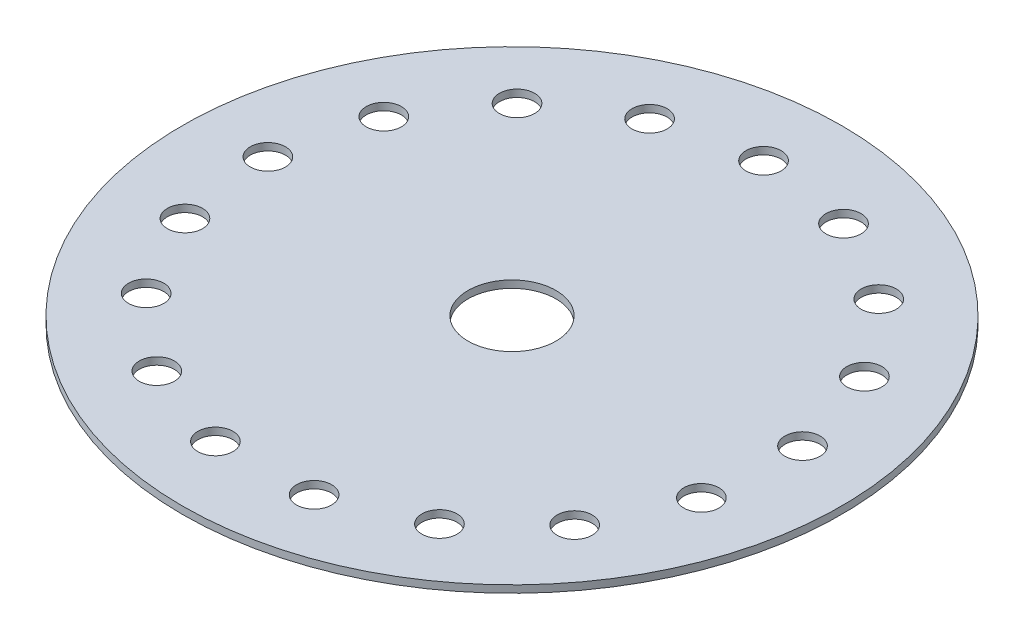
ISO-10303-21;
HEADER;
FILE_DESCRIPTION(('STEP AP214'),'2;1');
FILE_NAME('part.step','',(''),(''),'','','');
FILE_SCHEMA(('AUTOMOTIVE_DESIGN { 1 0 10303 214 1 1 1 1 }'));
ENDSEC;
DATA;
#1=APPLICATION_CONTEXT('core data for automotive mechanical design processes');
#2=APPLICATION_PROTOCOL_DEFINITION('international standard','automotive_design',2000,#1);
#3=PRODUCT_CONTEXT('',#1,'mechanical');
#4=PRODUCT('Part','Part','',(#3));
#5=PRODUCT_RELATED_PRODUCT_CATEGORY('part','',(#4));
#6=PRODUCT_DEFINITION_FORMATION('','',#4);
#7=PRODUCT_DEFINITION_CONTEXT('part definition',#1,'design');
#8=PRODUCT_DEFINITION('design','',#6,#7);
#9=PRODUCT_DEFINITION_SHAPE('','',#8);
#10=(LENGTH_UNIT() NAMED_UNIT(*) SI_UNIT(.MILLI.,.METRE.));
#11=(NAMED_UNIT(*) PLANE_ANGLE_UNIT() SI_UNIT($,.RADIAN.));
#12=(NAMED_UNIT(*) SI_UNIT($,.STERADIAN.) SOLID_ANGLE_UNIT());
#13=UNCERTAINTY_MEASURE_WITH_UNIT(LENGTH_MEASURE(1.E-05),#10,'distance_accuracy_value','');
#14=(GEOMETRIC_REPRESENTATION_CONTEXT(3) GLOBAL_UNCERTAINTY_ASSIGNED_CONTEXT((#13)) GLOBAL_UNIT_ASSIGNED_CONTEXT((#10,
#11,#12)) REPRESENTATION_CONTEXT('',''));
#15=CARTESIAN_POINT('',(0.,0.,0.));
#16=DIRECTION('',(0.,0.,1.));
#17=DIRECTION('',(1.,0.,0.));
#18=AXIS2_PLACEMENT_3D('',#15,#16,#17);
#19=CARTESIAN_POINT('',(0.,2.,0.));
#20=DIRECTION('',(0.,1.,0.));
#21=DIRECTION('',(0.,0.,1.));
#22=AXIS2_PLACEMENT_3D('',#19,#20,#21);
#23=PLANE('',#22);
#24=CARTESIAN_POINT('',(62.5298580621785,2.,-33.7169916053444));
#25=DIRECTION('',(0.,1.,0.));
#26=DIRECTION('',(0.,0.,1.));
#27=AXIS2_PLACEMENT_3D('',#24,#25,#26);
#28=CIRCLE('',#27,4.8);
#29=CARTESIAN_POINT('',(62.5298580621785,2.,-28.9169916053444));
#30=VERTEX_POINT('',#29);
#31=EDGE_CURVE('E135',#30,#30,#28,.T.);
#32=ORIENTED_EDGE('',*,*,#31,.F.);
#33=EDGE_LOOP('',(#32));
#34=FACE_BOUND('',#33,.T.);
#35=CARTESIAN_POINT('',(23.4951323391043,2.,-67.0432504325308));
#36=DIRECTION('',(0.,1.,0.));
#37=DIRECTION('',(0.,0.,1.));
#38=AXIS2_PLACEMENT_3D('',#35,#36,#37);
#39=CIRCLE('',#38,4.8);
#40=CARTESIAN_POINT('',(23.4951323391043,2.,-62.2432504325308));
#41=VERTEX_POINT('',#40);
#42=EDGE_CURVE('E123',#41,#41,#39,.T.);
#43=ORIENTED_EDGE('',*,*,#42,.F.);
#44=EDGE_LOOP('',(#43));
#45=FACE_BOUND('',#44,.T.);
#46=CARTESIAN_POINT('',(-27.8036334424233,2.,-65.3741282128519));
#47=DIRECTION('',(0.,1.,0.));
#48=DIRECTION('',(0.,0.,1.));
#49=AXIS2_PLACEMENT_3D('',#46,#47,#48);
#50=CIRCLE('',#49,4.8);
#51=CARTESIAN_POINT('',(-27.8036334424233,2.,-60.5741282128519));
#52=VERTEX_POINT('',#51);
#53=EDGE_CURVE('E111',#52,#52,#50,.T.);
#54=ORIENTED_EDGE('',*,*,#53,.F.);
#55=EDGE_LOOP('',(#54));
#56=FACE_BOUND('',#55,.T.);
#57=CARTESIAN_POINT('',(-64.5893984292749,2.,-29.5808769771179));
#58=DIRECTION('',(0.,1.,0.));
#59=DIRECTION('',(0.,0.,1.));
#60=AXIS2_PLACEMENT_3D('',#57,#58,#59);
#61=CIRCLE('',#60,4.8);
#62=CARTESIAN_POINT('',(-64.5893984292749,2.,-24.7808769771179));
#63=VERTEX_POINT('',#62);
#64=EDGE_CURVE('E99',#63,#63,#61,.T.);
#65=ORIENTED_EDGE('',*,*,#64,.F.);
#66=EDGE_LOOP('',(#65));
#67=FACE_BOUND('',#66,.T.);
#68=CARTESIAN_POINT('',(-67.6606493518809,2.,21.6530644822569));
#69=DIRECTION('',(0.,1.,0.));
#70=DIRECTION('',(0.,0.,1.));
#71=AXIS2_PLACEMENT_3D('',#68,#69,#70);
#72=CIRCLE('',#71,4.8);
#73=CARTESIAN_POINT('',(-67.6606493518809,2.,26.4530644822569));
#74=VERTEX_POINT('',#73);
#75=EDGE_CURVE('E87',#74,#74,#72,.T.);
#76=ORIENTED_EDGE('',*,*,#75,.F.);
#77=EDGE_LOOP('',(#76));
#78=FACE_BOUND('',#77,.T.);
#79=CARTESIAN_POINT('',(-35.4142480026854,2.,61.5844924522013));
#80=DIRECTION('',(0.,1.,0.));
#81=DIRECTION('',(0.,0.,1.));
#82=AXIS2_PLACEMENT_3D('',#79,#80,#81);
#83=CIRCLE('',#82,4.8);
#84=CARTESIAN_POINT('',(-35.4142480026854,2.,66.3844924522013));
#85=VERTEX_POINT('',#84);
#86=EDGE_CURVE('E75',#85,#85,#83,.T.);
#87=ORIENTED_EDGE('',*,*,#86,.F.);
#88=EDGE_LOOP('',(#87));
#89=FACE_BOUND('',#88,.T.);
#90=CARTESIAN_POINT('',(15.3177592105839,2.,69.369913687113));
#91=DIRECTION('',(0.,1.,0.));
#92=DIRECTION('',(0.,0.,1.));
#93=AXIS2_PLACEMENT_3D('',#90,#91,#92);
#94=CIRCLE('',#93,4.80000000000006);
#95=CARTESIAN_POINT('',(15.3177592105839,2.,74.1699136871131));
#96=VERTEX_POINT('',#95);
#97=EDGE_CURVE('E63',#96,#96,#94,.T.);
#98=ORIENTED_EDGE('',*,*,#97,.F.);
#99=EDGE_LOOP('',(#98));
#100=FACE_BOUND('',#99,.T.);
#101=CARTESIAN_POINT('',(58.0541692996061,2.,40.9454771510065));
#102=DIRECTION('',(0.,1.,0.));
#103=DIRECTION('',(0.,0.,1.));
#104=AXIS2_PLACEMENT_3D('',#101,#102,#103);
#105=CIRCLE('',#104,4.80000000000068);
#106=CARTESIAN_POINT('',(58.0541692996061,2.,45.7454771510072));
#107=VERTEX_POINT('',#106);
#108=EDGE_CURVE('E51',#107,#107,#105,.T.);
#109=ORIENTED_EDGE('',*,*,#108,.F.);
#110=EDGE_LOOP('',(#109));
#111=FACE_BOUND('',#110,.T.);
#112=CARTESIAN_POINT('',(68.9251130618793,2.,17.2089355161233));
#113=DIRECTION('',(0.,1.,0.));
#114=DIRECTION('',(0.,0.,1.));
#115=AXIS2_PLACEMENT_3D('',#112,#113,#114);
#116=CIRCLE('',#115,4.80000000000065);
#117=CARTESIAN_POINT('',(68.9251130618793,2.,22.008935516124));
#118=VERTEX_POINT('',#117);
#119=EDGE_CURVE('E40',#118,#118,#116,.T.);
#120=ORIENTED_EDGE('',*,*,#119,.F.);
#121=EDGE_LOOP('',(#120));
#122=FACE_BOUND('',#121,.T.);
#123=CARTESIAN_POINT('',(0.,2.,0.));
#124=DIRECTION('',(0.,1.,0.));
#125=DIRECTION('',(0.,0.,1.));
#126=AXIS2_PLACEMENT_3D('',#123,#124,#125);
#127=CIRCLE('',#126,90.);
#128=CARTESIAN_POINT('',(0.,2.,90.));
#129=VERTEX_POINT('',#128);
#130=EDGE_CURVE('E10',#129,#129,#127,.T.);
#131=ORIENTED_EDGE('',*,*,#130,.T.);
#132=EDGE_LOOP('',(#131));
#133=FACE_BOUND('',#132,.T.);
#134=CARTESIAN_POINT('',(0.,2.,0.));
#135=DIRECTION('',(0.,1.,0.));
#136=DIRECTION('',(0.,0.,1.));
#137=AXIS2_PLACEMENT_3D('',#134,#135,#136);
#138=CIRCLE('',#137,12.);
#139=CARTESIAN_POINT('',(0.,2.,12.));
#140=VERTEX_POINT('',#139);
#141=EDGE_CURVE('E45',#140,#140,#138,.T.);
#142=ORIENTED_EDGE('',*,*,#141,.F.);
#143=EDGE_LOOP('',(#142));
#144=FACE_BOUND('',#143,.T.);
#145=CARTESIAN_POINT('',(39.342688284164,2.,59.152105209925));
#146=DIRECTION('',(0.,1.,0.));
#147=DIRECTION('',(0.,0.,1.));
#148=AXIS2_PLACEMENT_3D('',#145,#146,#147);
#149=CIRCLE('',#148,4.80000000000013);
#150=CARTESIAN_POINT('',(39.342688284164,2.,63.9521052099251));
#151=VERTEX_POINT('',#150);
#152=EDGE_CURVE('E57',#151,#151,#149,.T.);
#153=ORIENTED_EDGE('',*,*,#152,.F.);
#154=EDGE_LOOP('',(#153));
#155=FACE_BOUND('',#154,.T.);
#156=CARTESIAN_POINT('',(-10.7759181230195,2.,70.2189309288949));
#157=DIRECTION('',(0.,1.,0.));
#158=DIRECTION('',(0.,0.,1.));
#159=AXIS2_PLACEMENT_3D('',#156,#157,#158);
#160=CIRCLE('',#159,4.80000000000007);
#161=CARTESIAN_POINT('',(-10.7759181230195,2.,75.018930928895));
#162=VERTEX_POINT('',#161);
#163=EDGE_CURVE('E69',#162,#162,#160,.T.);
#164=ORIENTED_EDGE('',*,*,#163,.F.);
#165=EDGE_LOOP('',(#164));
#166=FACE_BOUND('',#165,.T.);
#167=CARTESIAN_POINT('',(-55.2696874524663,2.,44.6327270183846));
#168=DIRECTION('',(0.,1.,0.));
#169=DIRECTION('',(0.,0.,1.));
#170=AXIS2_PLACEMENT_3D('',#167,#168,#169);
#171=CIRCLE('',#170,4.8);
#172=CARTESIAN_POINT('',(-55.2696874524663,2.,49.4327270183846));
#173=VERTEX_POINT('',#172);
#174=EDGE_CURVE('E81',#173,#173,#171,.T.);
#175=ORIENTED_EDGE('',*,*,#174,.F.);
#176=EDGE_LOOP('',(#175));
#177=FACE_BOUND('',#176,.T.);
#178=CARTESIAN_POINT('',(-70.9136656357233,2.,-4.25096439597189));
#179=DIRECTION('',(0.,1.,0.));
#180=DIRECTION('',(0.,0.,1.));
#181=AXIS2_PLACEMENT_3D('',#178,#179,#180);
#182=CIRCLE('',#181,4.8);
#183=CARTESIAN_POINT('',(-70.9136656357233,2.,0.549035604028111));
#184=VERTEX_POINT('',#183);
#185=EDGE_CURVE('E93',#184,#184,#182,.T.);
#186=ORIENTED_EDGE('',*,*,#185,.F.);
#187=EDGE_LOOP('',(#186));
#188=FACE_BOUND('',#187,.T.);
#189=CARTESIAN_POINT('',(-49.541975062741,2.,-50.9157282092063));
#190=DIRECTION('',(0.,1.,0.));
#191=DIRECTION('',(0.,0.,1.));
#192=AXIS2_PLACEMENT_3D('',#189,#190,#191);
#193=CIRCLE('',#192,4.8);
#194=CARTESIAN_POINT('',(-49.541975062741,2.,-46.1157282092063));
#195=VERTEX_POINT('',#194);
#196=EDGE_CURVE('E105',#195,#195,#193,.T.);
#197=ORIENTED_EDGE('',*,*,#196,.F.);
#198=EDGE_LOOP('',(#197));
#199=FACE_BOUND('',#198,.T.);
#200=CARTESIAN_POINT('',(-2.31025706045491,2.,-71.0033899508021));
#201=DIRECTION('',(0.,1.,0.));
#202=DIRECTION('',(0.,0.,1.));
#203=AXIS2_PLACEMENT_3D('',#200,#201,#202);
#204=CIRCLE('',#203,4.8);
#205=CARTESIAN_POINT('',(-2.31025706045491,2.,-66.2033899508021));
#206=VERTEX_POINT('',#205);
#207=EDGE_CURVE('E117',#206,#206,#204,.T.);
#208=ORIENTED_EDGE('',*,*,#207,.F.);
#209=EDGE_LOOP('',(#208));
#210=FACE_BOUND('',#209,.T.);
#211=CARTESIAN_POINT('',(46.1273739252448,2.,-54.0285484438709));
#212=DIRECTION('',(0.,1.,0.));
#213=DIRECTION('',(0.,0.,1.));
#214=AXIS2_PLACEMENT_3D('',#211,#212,#213);
#215=CIRCLE('',#214,4.8);
#216=CARTESIAN_POINT('',(46.1273739252448,2.,-49.2285484438709));
#217=VERTEX_POINT('',#216);
#218=EDGE_CURVE('E129',#217,#217,#215,.T.);
#219=ORIENTED_EDGE('',*,*,#218,.F.);
#220=EDGE_LOOP('',(#219));
#221=FACE_BOUND('',#220,.T.);
#222=CARTESIAN_POINT('',(70.4873383779096,2.,-8.85176821821591));
#223=DIRECTION('',(0.,1.,0.));
#224=DIRECTION('',(0.,0.,1.));
#225=AXIS2_PLACEMENT_3D('',#222,#223,#224);
#226=CIRCLE('',#225,4.8);
#227=CARTESIAN_POINT('',(70.4873383779096,2.,-4.05176821821591));
#228=VERTEX_POINT('',#227);
#229=EDGE_CURVE('E141',#228,#228,#226,.T.);
#230=ORIENTED_EDGE('',*,*,#229,.F.);
#231=EDGE_LOOP('',(#230));
#232=FACE_BOUND('',#231,.T.);
#233=ADVANCED_FACE('F29',(#34,#45,#56,#67,#78,#89,#100,#111,#122,#133,#144,#155,#166,#177,#188,
#199,#210,#221,#232),#23,.T.);
#234=CARTESIAN_POINT('',(0.,0.,0.));
#235=DIRECTION('',(0.,1.,0.));
#236=DIRECTION('',(0.,0.,1.));
#237=AXIS2_PLACEMENT_3D('',#234,#235,#236);
#238=PLANE('',#237);
#239=CARTESIAN_POINT('',(62.5298580621785,0.,-33.7169916053444));
#240=DIRECTION('',(0.,1.,0.));
#241=DIRECTION('',(0.,0.,1.));
#242=AXIS2_PLACEMENT_3D('',#239,#240,#241);
#243=CIRCLE('',#242,4.8);
#244=CARTESIAN_POINT('',(62.5298580621785,0.,-28.9169916053444));
#245=VERTEX_POINT('',#244);
#246=EDGE_CURVE('E138',#245,#245,#243,.T.);
#247=ORIENTED_EDGE('',*,*,#246,.T.);
#248=EDGE_LOOP('',(#247));
#249=FACE_BOUND('',#248,.T.);
#250=CARTESIAN_POINT('',(23.4951323391043,0.,-67.0432504325308));
#251=DIRECTION('',(0.,1.,0.));
#252=DIRECTION('',(0.,0.,1.));
#253=AXIS2_PLACEMENT_3D('',#250,#251,#252);
#254=CIRCLE('',#253,4.8);
#255=CARTESIAN_POINT('',(23.4951323391043,0.,-62.2432504325308));
#256=VERTEX_POINT('',#255);
#257=EDGE_CURVE('E126',#256,#256,#254,.T.);
#258=ORIENTED_EDGE('',*,*,#257,.T.);
#259=EDGE_LOOP('',(#258));
#260=FACE_BOUND('',#259,.T.);
#261=CARTESIAN_POINT('',(-27.8036334424233,0.,-65.3741282128519));
#262=DIRECTION('',(0.,1.,0.));
#263=DIRECTION('',(0.,0.,1.));
#264=AXIS2_PLACEMENT_3D('',#261,#262,#263);
#265=CIRCLE('',#264,4.8);
#266=CARTESIAN_POINT('',(-27.8036334424233,0.,-60.5741282128519));
#267=VERTEX_POINT('',#266);
#268=EDGE_CURVE('E114',#267,#267,#265,.T.);
#269=ORIENTED_EDGE('',*,*,#268,.T.);
#270=EDGE_LOOP('',(#269));
#271=FACE_BOUND('',#270,.T.);
#272=CARTESIAN_POINT('',(-64.5893984292749,0.,-29.5808769771179));
#273=DIRECTION('',(0.,1.,0.));
#274=DIRECTION('',(0.,0.,1.));
#275=AXIS2_PLACEMENT_3D('',#272,#273,#274);
#276=CIRCLE('',#275,4.8);
#277=CARTESIAN_POINT('',(-64.5893984292749,0.,-24.7808769771179));
#278=VERTEX_POINT('',#277);
#279=EDGE_CURVE('E102',#278,#278,#276,.T.);
#280=ORIENTED_EDGE('',*,*,#279,.T.);
#281=EDGE_LOOP('',(#280));
#282=FACE_BOUND('',#281,.T.);
#283=CARTESIAN_POINT('',(-67.6606493518809,0.,21.6530644822569));
#284=DIRECTION('',(0.,1.,0.));
#285=DIRECTION('',(0.,0.,1.));
#286=AXIS2_PLACEMENT_3D('',#283,#284,#285);
#287=CIRCLE('',#286,4.8);
#288=CARTESIAN_POINT('',(-67.6606493518809,0.,26.4530644822569));
#289=VERTEX_POINT('',#288);
#290=EDGE_CURVE('E90',#289,#289,#287,.T.);
#291=ORIENTED_EDGE('',*,*,#290,.T.);
#292=EDGE_LOOP('',(#291));
#293=FACE_BOUND('',#292,.T.);
#294=CARTESIAN_POINT('',(-35.4142480026854,0.,61.5844924522013));
#295=DIRECTION('',(0.,1.,0.));
#296=DIRECTION('',(0.,0.,1.));
#297=AXIS2_PLACEMENT_3D('',#294,#295,#296);
#298=CIRCLE('',#297,4.8);
#299=CARTESIAN_POINT('',(-35.4142480026854,0.,66.3844924522013));
#300=VERTEX_POINT('',#299);
#301=EDGE_CURVE('E78',#300,#300,#298,.T.);
#302=ORIENTED_EDGE('',*,*,#301,.T.);
#303=EDGE_LOOP('',(#302));
#304=FACE_BOUND('',#303,.T.);
#305=CARTESIAN_POINT('',(15.3177592105839,0.,69.369913687113));
#306=DIRECTION('',(0.,1.,0.));
#307=DIRECTION('',(0.,0.,1.));
#308=AXIS2_PLACEMENT_3D('',#305,#306,#307);
#309=CIRCLE('',#308,4.80000000000006);
#310=CARTESIAN_POINT('',(15.3177592105839,0.,74.1699136871131));
#311=VERTEX_POINT('',#310);
#312=EDGE_CURVE('E66',#311,#311,#309,.T.);
#313=ORIENTED_EDGE('',*,*,#312,.T.);
#314=EDGE_LOOP('',(#313));
#315=FACE_BOUND('',#314,.T.);
#316=CARTESIAN_POINT('',(58.0541692996061,0.,40.9454771510065));
#317=DIRECTION('',(0.,1.,0.));
#318=DIRECTION('',(0.,0.,1.));
#319=AXIS2_PLACEMENT_3D('',#316,#317,#318);
#320=CIRCLE('',#319,4.80000000000068);
#321=CARTESIAN_POINT('',(58.0541692996061,0.,45.7454771510072));
#322=VERTEX_POINT('',#321);
#323=EDGE_CURVE('E54',#322,#322,#320,.T.);
#324=ORIENTED_EDGE('',*,*,#323,.T.);
#325=EDGE_LOOP('',(#324));
#326=FACE_BOUND('',#325,.T.);
#327=CARTESIAN_POINT('',(68.9251130618793,0.,17.2089355161233));
#328=DIRECTION('',(0.,1.,0.));
#329=DIRECTION('',(0.,0.,1.));
#330=AXIS2_PLACEMENT_3D('',#327,#328,#329);
#331=CIRCLE('',#330,4.80000000000065);
#332=CARTESIAN_POINT('',(68.9251130618793,0.,22.008935516124));
#333=VERTEX_POINT('',#332);
#334=EDGE_CURVE('E42',#333,#333,#331,.T.);
#335=ORIENTED_EDGE('',*,*,#334,.T.);
#336=EDGE_LOOP('',(#335));
#337=FACE_BOUND('',#336,.T.);
#338=CARTESIAN_POINT('',(0.,0.,0.));
#339=DIRECTION('',(0.,1.,0.));
#340=DIRECTION('',(0.,0.,1.));
#341=AXIS2_PLACEMENT_3D('',#338,#339,#340);
#342=CIRCLE('',#341,90.);
#343=CARTESIAN_POINT('',(0.,0.,90.));
#344=VERTEX_POINT('',#343);
#345=EDGE_CURVE('E33',#344,#344,#342,.T.);
#346=ORIENTED_EDGE('',*,*,#345,.F.);
#347=EDGE_LOOP('',(#346));
#348=FACE_BOUND('',#347,.T.);
#349=CARTESIAN_POINT('',(0.,0.,0.));
#350=DIRECTION('',(0.,1.,0.));
#351=DIRECTION('',(0.,0.,1.));
#352=AXIS2_PLACEMENT_3D('',#349,#350,#351);
#353=CIRCLE('',#352,12.);
#354=CARTESIAN_POINT('',(0.,0.,12.));
#355=VERTEX_POINT('',#354);
#356=EDGE_CURVE('E48',#355,#355,#353,.T.);
#357=ORIENTED_EDGE('',*,*,#356,.T.);
#358=EDGE_LOOP('',(#357));
#359=FACE_BOUND('',#358,.T.);
#360=CARTESIAN_POINT('',(39.342688284164,0.,59.152105209925));
#361=DIRECTION('',(0.,1.,0.));
#362=DIRECTION('',(0.,0.,1.));
#363=AXIS2_PLACEMENT_3D('',#360,#361,#362);
#364=CIRCLE('',#363,4.80000000000013);
#365=CARTESIAN_POINT('',(39.342688284164,0.,63.9521052099251));
#366=VERTEX_POINT('',#365);
#367=EDGE_CURVE('E60',#366,#366,#364,.T.);
#368=ORIENTED_EDGE('',*,*,#367,.T.);
#369=EDGE_LOOP('',(#368));
#370=FACE_BOUND('',#369,.T.);
#371=CARTESIAN_POINT('',(-10.7759181230195,0.,70.2189309288949));
#372=DIRECTION('',(0.,1.,0.));
#373=DIRECTION('',(0.,0.,1.));
#374=AXIS2_PLACEMENT_3D('',#371,#372,#373);
#375=CIRCLE('',#374,4.80000000000007);
#376=CARTESIAN_POINT('',(-10.7759181230195,0.,75.018930928895));
#377=VERTEX_POINT('',#376);
#378=EDGE_CURVE('E72',#377,#377,#375,.T.);
#379=ORIENTED_EDGE('',*,*,#378,.T.);
#380=EDGE_LOOP('',(#379));
#381=FACE_BOUND('',#380,.T.);
#382=CARTESIAN_POINT('',(-55.2696874524663,0.,44.6327270183846));
#383=DIRECTION('',(0.,1.,0.));
#384=DIRECTION('',(0.,0.,1.));
#385=AXIS2_PLACEMENT_3D('',#382,#383,#384);
#386=CIRCLE('',#385,4.8);
#387=CARTESIAN_POINT('',(-55.2696874524663,0.,49.4327270183846));
#388=VERTEX_POINT('',#387);
#389=EDGE_CURVE('E84',#388,#388,#386,.T.);
#390=ORIENTED_EDGE('',*,*,#389,.T.);
#391=EDGE_LOOP('',(#390));
#392=FACE_BOUND('',#391,.T.);
#393=CARTESIAN_POINT('',(-70.9136656357233,0.,-4.25096439597189));
#394=DIRECTION('',(0.,1.,0.));
#395=DIRECTION('',(0.,0.,1.));
#396=AXIS2_PLACEMENT_3D('',#393,#394,#395);
#397=CIRCLE('',#396,4.8);
#398=CARTESIAN_POINT('',(-70.9136656357233,0.,0.549035604028111));
#399=VERTEX_POINT('',#398);
#400=EDGE_CURVE('E96',#399,#399,#397,.T.);
#401=ORIENTED_EDGE('',*,*,#400,.T.);
#402=EDGE_LOOP('',(#401));
#403=FACE_BOUND('',#402,.T.);
#404=CARTESIAN_POINT('',(-49.541975062741,0.,-50.9157282092063));
#405=DIRECTION('',(0.,1.,0.));
#406=DIRECTION('',(0.,0.,1.));
#407=AXIS2_PLACEMENT_3D('',#404,#405,#406);
#408=CIRCLE('',#407,4.8);
#409=CARTESIAN_POINT('',(-49.541975062741,0.,-46.1157282092063));
#410=VERTEX_POINT('',#409);
#411=EDGE_CURVE('E108',#410,#410,#408,.T.);
#412=ORIENTED_EDGE('',*,*,#411,.T.);
#413=EDGE_LOOP('',(#412));
#414=FACE_BOUND('',#413,.T.);
#415=CARTESIAN_POINT('',(-2.31025706045491,0.,-71.0033899508021));
#416=DIRECTION('',(0.,1.,0.));
#417=DIRECTION('',(0.,0.,1.));
#418=AXIS2_PLACEMENT_3D('',#415,#416,#417);
#419=CIRCLE('',#418,4.8);
#420=CARTESIAN_POINT('',(-2.31025706045491,0.,-66.2033899508021));
#421=VERTEX_POINT('',#420);
#422=EDGE_CURVE('E120',#421,#421,#419,.T.);
#423=ORIENTED_EDGE('',*,*,#422,.T.);
#424=EDGE_LOOP('',(#423));
#425=FACE_BOUND('',#424,.T.);
#426=CARTESIAN_POINT('',(46.1273739252448,0.,-54.0285484438709));
#427=DIRECTION('',(0.,1.,0.));
#428=DIRECTION('',(0.,0.,1.));
#429=AXIS2_PLACEMENT_3D('',#426,#427,#428);
#430=CIRCLE('',#429,4.8);
#431=CARTESIAN_POINT('',(46.1273739252448,0.,-49.2285484438709));
#432=VERTEX_POINT('',#431);
#433=EDGE_CURVE('E132',#432,#432,#430,.T.);
#434=ORIENTED_EDGE('',*,*,#433,.T.);
#435=EDGE_LOOP('',(#434));
#436=FACE_BOUND('',#435,.T.);
#437=CARTESIAN_POINT('',(70.4873383779096,0.,-8.85176821821591));
#438=DIRECTION('',(0.,1.,0.));
#439=DIRECTION('',(0.,0.,1.));
#440=AXIS2_PLACEMENT_3D('',#437,#438,#439);
#441=CIRCLE('',#440,4.8);
#442=CARTESIAN_POINT('',(70.4873383779096,0.,-4.05176821821591));
#443=VERTEX_POINT('',#442);
#444=EDGE_CURVE('E144',#443,#443,#441,.T.);
#445=ORIENTED_EDGE('',*,*,#444,.T.);
#446=EDGE_LOOP('',(#445));
#447=FACE_BOUND('',#446,.T.);
#448=ADVANCED_FACE('F154',(#249,#260,#271,#282,#293,#304,#315,#326,#337,#348,#359,#370,#381,
#392,#403,#414,#425,#436,#447),#238,.F.);
#449=CARTESIAN_POINT('',(0.,2.,0.));
#450=DIRECTION('',(0.,-1.,0.));
#451=DIRECTION('',(0.,0.,-1.));
#452=AXIS2_PLACEMENT_3D('',#449,#450,#451);
#453=CYLINDRICAL_SURFACE('',#452,90.);
#454=ORIENTED_EDGE('',*,*,#130,.F.);
#455=EDGE_LOOP('',(#454));
#456=FACE_BOUND('',#455,.T.);
#457=ORIENTED_EDGE('',*,*,#345,.T.);
#458=EDGE_LOOP('',(#457));
#459=FACE_BOUND('',#458,.T.);
#460=ADVANCED_FACE('F31',(#456,#459),#453,.T.);
#461=CARTESIAN_POINT('',(68.9251130618793,2.,17.2089355161233));
#462=DIRECTION('',(0.,-1.,0.));
#463=DIRECTION('',(0.,0.,-1.));
#464=AXIS2_PLACEMENT_3D('',#461,#462,#463);
#465=CYLINDRICAL_SURFACE('',#464,4.80000000000065);
#466=ORIENTED_EDGE('',*,*,#119,.T.);
#467=EDGE_LOOP('',(#466));
#468=FACE_BOUND('',#467,.T.);
#469=ORIENTED_EDGE('',*,*,#334,.F.);
#470=EDGE_LOOP('',(#469));
#471=FACE_BOUND('',#470,.T.);
#472=ADVANCED_FACE('F164',(#468,#471),#465,.F.);
#473=CARTESIAN_POINT('',(0.,2.,0.));
#474=DIRECTION('',(0.,-1.,0.));
#475=DIRECTION('',(0.,0.,-1.));
#476=AXIS2_PLACEMENT_3D('',#473,#474,#475);
#477=CYLINDRICAL_SURFACE('',#476,12.);
#478=ORIENTED_EDGE('',*,*,#141,.T.);
#479=EDGE_LOOP('',(#478));
#480=FACE_BOUND('',#479,.T.);
#481=ORIENTED_EDGE('',*,*,#356,.F.);
#482=EDGE_LOOP('',(#481));
#483=FACE_BOUND('',#482,.T.);
#484=ADVANCED_FACE('F167',(#480,#483),#477,.F.);
#485=CARTESIAN_POINT('',(58.0541692996061,2.,40.9454771510065));
#486=DIRECTION('',(0.,-1.,0.));
#487=DIRECTION('',(0.,0.,-1.));
#488=AXIS2_PLACEMENT_3D('',#485,#486,#487);
#489=CYLINDRICAL_SURFACE('',#488,4.80000000000068);
#490=ORIENTED_EDGE('',*,*,#108,.T.);
#491=EDGE_LOOP('',(#490));
#492=FACE_BOUND('',#491,.T.);
#493=ORIENTED_EDGE('',*,*,#323,.F.);
#494=EDGE_LOOP('',(#493));
#495=FACE_BOUND('',#494,.T.);
#496=ADVANCED_FACE('F171',(#492,#495),#489,.F.);
#497=CARTESIAN_POINT('',(39.342688284164,2.,59.152105209925));
#498=DIRECTION('',(0.,-1.,0.));
#499=DIRECTION('',(0.,0.,-1.));
#500=AXIS2_PLACEMENT_3D('',#497,#498,#499);
#501=CYLINDRICAL_SURFACE('',#500,4.80000000000013);
#502=ORIENTED_EDGE('',*,*,#152,.T.);
#503=EDGE_LOOP('',(#502));
#504=FACE_BOUND('',#503,.T.);
#505=ORIENTED_EDGE('',*,*,#367,.F.);
#506=EDGE_LOOP('',(#505));
#507=FACE_BOUND('',#506,.T.);
#508=ADVANCED_FACE('F175',(#504,#507),#501,.F.);
#509=CARTESIAN_POINT('',(15.3177592105839,2.,69.369913687113));
#510=DIRECTION('',(0.,-1.,0.));
#511=DIRECTION('',(0.,0.,-1.));
#512=AXIS2_PLACEMENT_3D('',#509,#510,#511);
#513=CYLINDRICAL_SURFACE('',#512,4.80000000000006);
#514=ORIENTED_EDGE('',*,*,#97,.T.);
#515=EDGE_LOOP('',(#514));
#516=FACE_BOUND('',#515,.T.);
#517=ORIENTED_EDGE('',*,*,#312,.F.);
#518=EDGE_LOOP('',(#517));
#519=FACE_BOUND('',#518,.T.);
#520=ADVANCED_FACE('F179',(#516,#519),#513,.F.);
#521=CARTESIAN_POINT('',(-10.7759181230195,2.,70.2189309288949));
#522=DIRECTION('',(0.,-1.,0.));
#523=DIRECTION('',(0.,0.,-1.));
#524=AXIS2_PLACEMENT_3D('',#521,#522,#523);
#525=CYLINDRICAL_SURFACE('',#524,4.80000000000007);
#526=ORIENTED_EDGE('',*,*,#163,.T.);
#527=EDGE_LOOP('',(#526));
#528=FACE_BOUND('',#527,.T.);
#529=ORIENTED_EDGE('',*,*,#378,.F.);
#530=EDGE_LOOP('',(#529));
#531=FACE_BOUND('',#530,.T.);
#532=ADVANCED_FACE('F183',(#528,#531),#525,.F.);
#533=CARTESIAN_POINT('',(-35.4142480026854,2.,61.5844924522013));
#534=DIRECTION('',(0.,-1.,0.));
#535=DIRECTION('',(0.,0.,-1.));
#536=AXIS2_PLACEMENT_3D('',#533,#534,#535);
#537=CYLINDRICAL_SURFACE('',#536,4.8);
#538=ORIENTED_EDGE('',*,*,#86,.T.);
#539=EDGE_LOOP('',(#538));
#540=FACE_BOUND('',#539,.T.);
#541=ORIENTED_EDGE('',*,*,#301,.F.);
#542=EDGE_LOOP('',(#541));
#543=FACE_BOUND('',#542,.T.);
#544=ADVANCED_FACE('F187',(#540,#543),#537,.F.);
#545=CARTESIAN_POINT('',(-55.2696874524663,2.,44.6327270183846));
#546=DIRECTION('',(0.,-1.,0.));
#547=DIRECTION('',(0.,0.,-1.));
#548=AXIS2_PLACEMENT_3D('',#545,#546,#547);
#549=CYLINDRICAL_SURFACE('',#548,4.8);
#550=ORIENTED_EDGE('',*,*,#174,.T.);
#551=EDGE_LOOP('',(#550));
#552=FACE_BOUND('',#551,.T.);
#553=ORIENTED_EDGE('',*,*,#389,.F.);
#554=EDGE_LOOP('',(#553));
#555=FACE_BOUND('',#554,.T.);
#556=ADVANCED_FACE('F191',(#552,#555),#549,.F.);
#557=CARTESIAN_POINT('',(-67.6606493518809,2.,21.6530644822569));
#558=DIRECTION('',(0.,-1.,0.));
#559=DIRECTION('',(0.,0.,-1.));
#560=AXIS2_PLACEMENT_3D('',#557,#558,#559);
#561=CYLINDRICAL_SURFACE('',#560,4.8);
#562=ORIENTED_EDGE('',*,*,#75,.T.);
#563=EDGE_LOOP('',(#562));
#564=FACE_BOUND('',#563,.T.);
#565=ORIENTED_EDGE('',*,*,#290,.F.);
#566=EDGE_LOOP('',(#565));
#567=FACE_BOUND('',#566,.T.);
#568=ADVANCED_FACE('F195',(#564,#567),#561,.F.);
#569=CARTESIAN_POINT('',(-70.9136656357233,2.,-4.25096439597189));
#570=DIRECTION('',(0.,-1.,0.));
#571=DIRECTION('',(0.,0.,-1.));
#572=AXIS2_PLACEMENT_3D('',#569,#570,#571);
#573=CYLINDRICAL_SURFACE('',#572,4.8);
#574=ORIENTED_EDGE('',*,*,#185,.T.);
#575=EDGE_LOOP('',(#574));
#576=FACE_BOUND('',#575,.T.);
#577=ORIENTED_EDGE('',*,*,#400,.F.);
#578=EDGE_LOOP('',(#577));
#579=FACE_BOUND('',#578,.T.);
#580=ADVANCED_FACE('F199',(#576,#579),#573,.F.);
#581=CARTESIAN_POINT('',(-64.5893984292749,2.,-29.5808769771179));
#582=DIRECTION('',(0.,-1.,0.));
#583=DIRECTION('',(0.,0.,-1.));
#584=AXIS2_PLACEMENT_3D('',#581,#582,#583);
#585=CYLINDRICAL_SURFACE('',#584,4.8);
#586=ORIENTED_EDGE('',*,*,#64,.T.);
#587=EDGE_LOOP('',(#586));
#588=FACE_BOUND('',#587,.T.);
#589=ORIENTED_EDGE('',*,*,#279,.F.);
#590=EDGE_LOOP('',(#589));
#591=FACE_BOUND('',#590,.T.);
#592=ADVANCED_FACE('F203',(#588,#591),#585,.F.);
#593=CARTESIAN_POINT('',(-49.541975062741,2.,-50.9157282092063));
#594=DIRECTION('',(0.,-1.,0.));
#595=DIRECTION('',(0.,0.,-1.));
#596=AXIS2_PLACEMENT_3D('',#593,#594,#595);
#597=CYLINDRICAL_SURFACE('',#596,4.8);
#598=ORIENTED_EDGE('',*,*,#196,.T.);
#599=EDGE_LOOP('',(#598));
#600=FACE_BOUND('',#599,.T.);
#601=ORIENTED_EDGE('',*,*,#411,.F.);
#602=EDGE_LOOP('',(#601));
#603=FACE_BOUND('',#602,.T.);
#604=ADVANCED_FACE('F207',(#600,#603),#597,.F.);
#605=CARTESIAN_POINT('',(-27.8036334424233,2.,-65.3741282128519));
#606=DIRECTION('',(0.,-1.,0.));
#607=DIRECTION('',(0.,0.,-1.));
#608=AXIS2_PLACEMENT_3D('',#605,#606,#607);
#609=CYLINDRICAL_SURFACE('',#608,4.8);
#610=ORIENTED_EDGE('',*,*,#53,.T.);
#611=EDGE_LOOP('',(#610));
#612=FACE_BOUND('',#611,.T.);
#613=ORIENTED_EDGE('',*,*,#268,.F.);
#614=EDGE_LOOP('',(#613));
#615=FACE_BOUND('',#614,.T.);
#616=ADVANCED_FACE('F211',(#612,#615),#609,.F.);
#617=CARTESIAN_POINT('',(-2.31025706045491,2.,-71.0033899508021));
#618=DIRECTION('',(0.,-1.,0.));
#619=DIRECTION('',(0.,0.,-1.));
#620=AXIS2_PLACEMENT_3D('',#617,#618,#619);
#621=CYLINDRICAL_SURFACE('',#620,4.8);
#622=ORIENTED_EDGE('',*,*,#207,.T.);
#623=EDGE_LOOP('',(#622));
#624=FACE_BOUND('',#623,.T.);
#625=ORIENTED_EDGE('',*,*,#422,.F.);
#626=EDGE_LOOP('',(#625));
#627=FACE_BOUND('',#626,.T.);
#628=ADVANCED_FACE('F215',(#624,#627),#621,.F.);
#629=CARTESIAN_POINT('',(23.4951323391043,2.,-67.0432504325308));
#630=DIRECTION('',(0.,-1.,0.));
#631=DIRECTION('',(0.,0.,-1.));
#632=AXIS2_PLACEMENT_3D('',#629,#630,#631);
#633=CYLINDRICAL_SURFACE('',#632,4.8);
#634=ORIENTED_EDGE('',*,*,#42,.T.);
#635=EDGE_LOOP('',(#634));
#636=FACE_BOUND('',#635,.T.);
#637=ORIENTED_EDGE('',*,*,#257,.F.);
#638=EDGE_LOOP('',(#637));
#639=FACE_BOUND('',#638,.T.);
#640=ADVANCED_FACE('F219',(#636,#639),#633,.F.);
#641=CARTESIAN_POINT('',(46.1273739252448,2.,-54.0285484438709));
#642=DIRECTION('',(0.,-1.,0.));
#643=DIRECTION('',(0.,0.,-1.));
#644=AXIS2_PLACEMENT_3D('',#641,#642,#643);
#645=CYLINDRICAL_SURFACE('',#644,4.8);
#646=ORIENTED_EDGE('',*,*,#218,.T.);
#647=EDGE_LOOP('',(#646));
#648=FACE_BOUND('',#647,.T.);
#649=ORIENTED_EDGE('',*,*,#433,.F.);
#650=EDGE_LOOP('',(#649));
#651=FACE_BOUND('',#650,.T.);
#652=ADVANCED_FACE('F223',(#648,#651),#645,.F.);
#653=CARTESIAN_POINT('',(62.5298580621785,2.,-33.7169916053444));
#654=DIRECTION('',(0.,-1.,0.));
#655=DIRECTION('',(0.,0.,-1.));
#656=AXIS2_PLACEMENT_3D('',#653,#654,#655);
#657=CYLINDRICAL_SURFACE('',#656,4.8);
#658=ORIENTED_EDGE('',*,*,#31,.T.);
#659=EDGE_LOOP('',(#658));
#660=FACE_BOUND('',#659,.T.);
#661=ORIENTED_EDGE('',*,*,#246,.F.);
#662=EDGE_LOOP('',(#661));
#663=FACE_BOUND('',#662,.T.);
#664=ADVANCED_FACE('F227',(#660,#663),#657,.F.);
#665=CARTESIAN_POINT('',(70.4873383779096,2.,-8.85176821821591));
#666=DIRECTION('',(0.,-1.,0.));
#667=DIRECTION('',(0.,0.,-1.));
#668=AXIS2_PLACEMENT_3D('',#665,#666,#667);
#669=CYLINDRICAL_SURFACE('',#668,4.8);
#670=ORIENTED_EDGE('',*,*,#229,.T.);
#671=EDGE_LOOP('',(#670));
#672=FACE_BOUND('',#671,.T.);
#673=ORIENTED_EDGE('',*,*,#444,.F.);
#674=EDGE_LOOP('',(#673));
#675=FACE_BOUND('',#674,.T.);
#676=ADVANCED_FACE('F150',(#672,#675),#669,.F.);
#677=CLOSED_SHELL('',(#233,#448,#460,#472,#484,#496,#508,#520,#532,#544,#556,#568,#580,#592,
#604,#616,#628,#640,#652,#664,#676));
#678=MANIFOLD_SOLID_BREP('B2',#677);
#679=ADVANCED_BREP_SHAPE_REPRESENTATION('',(#18,#678),#14);
#680=SHAPE_DEFINITION_REPRESENTATION(#9,#679);
ENDSEC;
END-ISO-10303-21;
